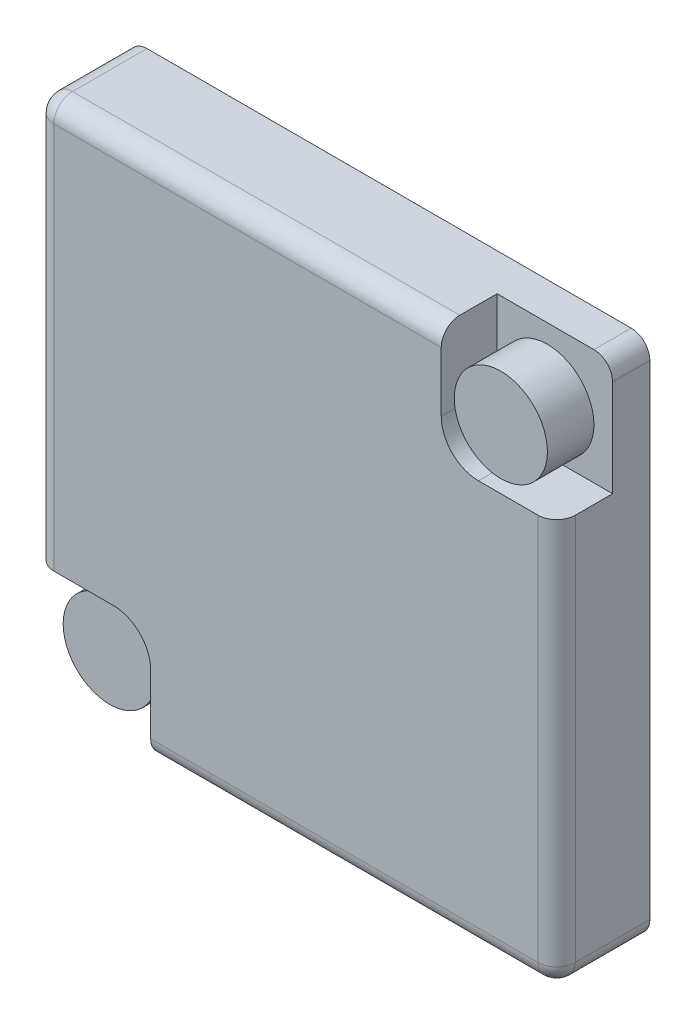
ISO-10303-21;
HEADER;
FILE_DESCRIPTION(('STEP AP214'),'2;1');
FILE_NAME('part.step','',(''),(''),'','','');
FILE_SCHEMA(('AUTOMOTIVE_DESIGN { 1 0 10303 214 1 1 1 1 }'));
ENDSEC;
DATA;
#1=APPLICATION_CONTEXT('core data for automotive mechanical design processes');
#2=APPLICATION_PROTOCOL_DEFINITION('international standard','automotive_design',2000,#1);
#3=PRODUCT_CONTEXT('',#1,'mechanical');
#4=PRODUCT('Part','Part','',(#3));
#5=PRODUCT_RELATED_PRODUCT_CATEGORY('part','',(#4));
#6=PRODUCT_DEFINITION_FORMATION('','',#4);
#7=PRODUCT_DEFINITION_CONTEXT('part definition',#1,'design');
#8=PRODUCT_DEFINITION('design','',#6,#7);
#9=PRODUCT_DEFINITION_SHAPE('','',#8);
#10=(LENGTH_UNIT() NAMED_UNIT(*) SI_UNIT(.MILLI.,.METRE.));
#11=(NAMED_UNIT(*) PLANE_ANGLE_UNIT() SI_UNIT($,.RADIAN.));
#12=(NAMED_UNIT(*) SI_UNIT($,.STERADIAN.) SOLID_ANGLE_UNIT());
#13=UNCERTAINTY_MEASURE_WITH_UNIT(LENGTH_MEASURE(1.E-05),#10,'distance_accuracy_value','');
#14=(GEOMETRIC_REPRESENTATION_CONTEXT(3) GLOBAL_UNCERTAINTY_ASSIGNED_CONTEXT((#13)) GLOBAL_UNIT_ASSIGNED_CONTEXT((#10,
#11,#12)) REPRESENTATION_CONTEXT('',''));
#15=CARTESIAN_POINT('',(0.,0.,0.));
#16=DIRECTION('',(0.,0.,1.));
#17=DIRECTION('',(1.,0.,0.));
#18=AXIS2_PLACEMENT_3D('',#15,#16,#17);
#19=CARTESIAN_POINT('',(-9.79999999999993,-9.80000000000006,-3.));
#20=DIRECTION('',(0.,0.,1.));
#21=DIRECTION('',(-1.,0.,0.));
#22=AXIS2_PLACEMENT_3D('',#19,#20,#21);
#23=PLANE('',#22);
#24=DIRECTION('',(1.,0.,0.));
#25=VECTOR('',#24,1.);
#26=CARTESIAN_POINT('',(-13.9999999999999,-14.0000000000001,-3.));
#27=LINE('',#26,#25);
#28=CARTESIAN_POINT('',(-13.,-14.0000000000001,-3.));
#29=VERTEX_POINT('',#28);
#30=CARTESIAN_POINT('',(-7.7999999999999,-14.,-3.));
#31=VERTEX_POINT('',#30);
#32=EDGE_CURVE('E164',#29,#31,#27,.T.);
#33=ORIENTED_EDGE('',*,*,#32,.T.);
#34=DIRECTION('',(0.,1.,0.));
#35=VECTOR('',#34,1.);
#36=CARTESIAN_POINT('',(-7.7999999999999,-14.,-3.));
#37=LINE('',#36,#35);
#38=CARTESIAN_POINT('',(-7.79999999999993,-9.80000000000005,-3.));
#39=VERTEX_POINT('',#38);
#40=EDGE_CURVE('E168',#31,#39,#37,.T.);
#41=ORIENTED_EDGE('',*,*,#40,.T.);
#42=CARTESIAN_POINT('',(-9.79999999999993,-9.80000000000006,-3.));
#43=DIRECTION('',(0.,0.,1.));
#44=DIRECTION('',(-1.,0.,0.));
#45=AXIS2_PLACEMENT_3D('',#42,#43,#44);
#46=CIRCLE('',#45,2.);
#47=CARTESIAN_POINT('',(-9.79999999999995,-7.80000000000006,-3.));
#48=VERTEX_POINT('',#47);
#49=EDGE_CURVE('E182',#39,#48,#46,.T.);
#50=ORIENTED_EDGE('',*,*,#49,.T.);
#51=DIRECTION('',(-1.,0.,0.));
#52=VECTOR('',#51,1.);
#53=CARTESIAN_POINT('',(-13.9999999999999,-7.80000000000009,-3.));
#54=LINE('',#53,#52);
#55=CARTESIAN_POINT('',(-13.9999999999999,-7.80000000000009,-3.));
#56=VERTEX_POINT('',#55);
#57=EDGE_CURVE('E188',#48,#56,#54,.T.);
#58=ORIENTED_EDGE('',*,*,#57,.T.);
#59=DIRECTION('',(0.,-1.,0.));
#60=VECTOR('',#59,1.);
#61=CARTESIAN_POINT('',(-13.9999999999999,-14.0000000000001,-3.));
#62=LINE('',#61,#60);
#63=CARTESIAN_POINT('',(-13.9999999999999,-13.,-3.));
#64=VERTEX_POINT('',#63);
#65=EDGE_CURVE('E173',#56,#64,#62,.T.);
#66=ORIENTED_EDGE('',*,*,#65,.T.);
#67=CARTESIAN_POINT('',(-13.,-13.,-3.));
#68=DIRECTION('',(0.,0.,1.));
#69=DIRECTION('',(1.,0.,0.));
#70=AXIS2_PLACEMENT_3D('',#67,#68,#69);
#71=CIRCLE('',#70,1.);
#72=EDGE_CURVE('E41',#29,#64,#71,.F.);
#73=ORIENTED_EDGE('',*,*,#72,.F.);
#74=EDGE_LOOP('',(#33,#41,#50,#58,#66,#73));
#75=FACE_BOUND('',#74,.T.);
#76=CARTESIAN_POINT('',(-10.4999999999999,-10.5000000000001,-3.));
#77=DIRECTION('',(0.,0.,1.));
#78=DIRECTION('',(-1.,0.,0.));
#79=AXIS2_PLACEMENT_3D('',#76,#77,#78);
#80=CIRCLE('',#79,2.5);
#81=CARTESIAN_POINT('',(-12.9999999999999,-10.5000000000001,-3.));
#82=VERTEX_POINT('',#81);
#83=EDGE_CURVE('E368',#82,#82,#80,.T.);
#84=ORIENTED_EDGE('',*,*,#83,.F.);
#85=EDGE_LOOP('',(#84));
#86=FACE_BOUND('',#85,.T.);
#87=ADVANCED_FACE('F33',(#75,#86),#23,.T.);
#88=CARTESIAN_POINT('',(-13.,-13.,-5.));
#89=DIRECTION('',(0.,0.,1.));
#90=DIRECTION('',(1.,0.,0.));
#91=AXIS2_PLACEMENT_3D('',#88,#89,#90);
#92=CYLINDRICAL_SURFACE('',#91,1.);
#93=DIRECTION('',(0.,0.,1.));
#94=VECTOR('',#93,1.);
#95=CARTESIAN_POINT('',(-13.,-14.,-5.));
#96=LINE('',#95,#94);
#97=CARTESIAN_POINT('',(-13.,-14.,-5.));
#98=VERTEX_POINT('',#97);
#99=EDGE_CURVE('E278',#29,#98,#96,.F.);
#100=ORIENTED_EDGE('',*,*,#99,.F.);
#101=ORIENTED_EDGE('',*,*,#72,.T.);
#102=DIRECTION('',(0.,0.,1.));
#103=VECTOR('',#102,1.);
#104=CARTESIAN_POINT('',(-14.,-13.,-5.));
#105=LINE('',#104,#103);
#106=CARTESIAN_POINT('',(-14.,-13.,-5.));
#107=VERTEX_POINT('',#106);
#108=EDGE_CURVE('E287',#107,#64,#105,.T.);
#109=ORIENTED_EDGE('',*,*,#108,.F.);
#110=CARTESIAN_POINT('',(-13.,-13.,-5.));
#111=DIRECTION('',(0.,0.,-1.));
#112=DIRECTION('',(-1.,0.,0.));
#113=AXIS2_PLACEMENT_3D('',#110,#111,#112);
#114=CIRCLE('',#113,1.);
#115=EDGE_CURVE('E272',#98,#107,#114,.T.);
#116=ORIENTED_EDGE('',*,*,#115,.F.);
#117=EDGE_LOOP('',(#100,#101,#109,#116));
#118=FACE_BOUND('',#117,.T.);
#119=ADVANCED_FACE('F316',(#118),#92,.T.);
#120=CARTESIAN_POINT('',(9.8,9.8,-3.));
#121=DIRECTION('',(0.,0.,1.));
#122=DIRECTION('',(1.,0.,0.));
#123=AXIS2_PLACEMENT_3D('',#120,#121,#122);
#124=PLANE('',#123);
#125=DIRECTION('',(-1.,0.,0.));
#126=VECTOR('',#125,1.);
#127=CARTESIAN_POINT('',(14.,14.,-3.));
#128=LINE('',#127,#126);
#129=CARTESIAN_POINT('',(13.,14.,-3.));
#130=VERTEX_POINT('',#129);
#131=CARTESIAN_POINT('',(7.8,14.,-3.));
#132=VERTEX_POINT('',#131);
#133=EDGE_CURVE('E206',#130,#132,#128,.T.);
#134=ORIENTED_EDGE('',*,*,#133,.T.);
#135=DIRECTION('',(0.,-1.,0.));
#136=VECTOR('',#135,1.);
#137=CARTESIAN_POINT('',(7.8,14.,-3.));
#138=LINE('',#137,#136);
#139=CARTESIAN_POINT('',(7.8,9.8,-3.));
#140=VERTEX_POINT('',#139);
#141=EDGE_CURVE('E209',#132,#140,#138,.T.);
#142=ORIENTED_EDGE('',*,*,#141,.T.);
#143=CARTESIAN_POINT('',(9.8,9.8,-3.));
#144=DIRECTION('',(0.,0.,1.));
#145=DIRECTION('',(1.,0.,0.));
#146=AXIS2_PLACEMENT_3D('',#143,#144,#145);
#147=CIRCLE('',#146,2.);
#148=CARTESIAN_POINT('',(9.8,7.8,-3.));
#149=VERTEX_POINT('',#148);
#150=EDGE_CURVE('E212',#140,#149,#147,.T.);
#151=ORIENTED_EDGE('',*,*,#150,.T.);
#152=DIRECTION('',(1.,0.,0.));
#153=VECTOR('',#152,1.);
#154=CARTESIAN_POINT('',(14.,7.8,-3.));
#155=LINE('',#154,#153);
#156=CARTESIAN_POINT('',(14.,7.8,-3.));
#157=VERTEX_POINT('',#156);
#158=EDGE_CURVE('E215',#149,#157,#155,.T.);
#159=ORIENTED_EDGE('',*,*,#158,.T.);
#160=DIRECTION('',(0.,1.,0.));
#161=VECTOR('',#160,1.);
#162=CARTESIAN_POINT('',(14.,14.,-3.));
#163=LINE('',#162,#161);
#164=CARTESIAN_POINT('',(14.,13.,-3.));
#165=VERTEX_POINT('',#164);
#166=EDGE_CURVE('E204',#157,#165,#163,.T.);
#167=ORIENTED_EDGE('',*,*,#166,.T.);
#168=CARTESIAN_POINT('',(13.,13.,-3.));
#169=DIRECTION('',(0.,0.,1.));
#170=DIRECTION('',(1.,0.,0.));
#171=AXIS2_PLACEMENT_3D('',#168,#169,#170);
#172=CIRCLE('',#171,1.);
#173=EDGE_CURVE('E310',#130,#165,#172,.F.);
#174=ORIENTED_EDGE('',*,*,#173,.F.);
#175=EDGE_LOOP('',(#134,#142,#151,#159,#167,#174));
#176=FACE_BOUND('',#175,.T.);
#177=CARTESIAN_POINT('',(10.5,10.5,-3.));
#178=DIRECTION('',(0.,0.,1.));
#179=DIRECTION('',(1.,0.,0.));
#180=AXIS2_PLACEMENT_3D('',#177,#178,#179);
#181=CIRCLE('',#180,2.5);
#182=CARTESIAN_POINT('',(13.,10.5,-3.));
#183=VERTEX_POINT('',#182);
#184=EDGE_CURVE('E200',#183,#183,#181,.T.);
#185=ORIENTED_EDGE('',*,*,#184,.F.);
#186=EDGE_LOOP('',(#185));
#187=FACE_BOUND('',#186,.T.);
#188=ADVANCED_FACE('F394',(#176,#187),#124,.T.);
#189=CARTESIAN_POINT('',(13.,13.,-5.));
#190=DIRECTION('',(0.,0.,1.));
#191=DIRECTION('',(1.,0.,0.));
#192=AXIS2_PLACEMENT_3D('',#189,#190,#191);
#193=CYLINDRICAL_SURFACE('',#192,1.);
#194=DIRECTION('',(0.,0.,1.));
#195=VECTOR('',#194,1.);
#196=CARTESIAN_POINT('',(13.,14.,-5.));
#197=LINE('',#196,#195);
#198=CARTESIAN_POINT('',(13.,14.,-5.));
#199=VERTEX_POINT('',#198);
#200=EDGE_CURVE('E261',#130,#199,#197,.F.);
#201=ORIENTED_EDGE('',*,*,#200,.F.);
#202=ORIENTED_EDGE('',*,*,#173,.T.);
#203=DIRECTION('',(0.,0.,1.));
#204=VECTOR('',#203,1.);
#205=CARTESIAN_POINT('',(14.,13.,-5.));
#206=LINE('',#205,#204);
#207=CARTESIAN_POINT('',(14.,13.,-5.));
#208=VERTEX_POINT('',#207);
#209=EDGE_CURVE('E267',#208,#165,#206,.T.);
#210=ORIENTED_EDGE('',*,*,#209,.F.);
#211=CARTESIAN_POINT('',(13.,13.,-5.));
#212=DIRECTION('',(0.,0.,-1.));
#213=DIRECTION('',(-1.,0.,0.));
#214=AXIS2_PLACEMENT_3D('',#211,#212,#213);
#215=CIRCLE('',#214,1.);
#216=EDGE_CURVE('E276',#199,#208,#215,.T.);
#217=ORIENTED_EDGE('',*,*,#216,.F.);
#218=EDGE_LOOP('',(#201,#202,#210,#217));
#219=FACE_BOUND('',#218,.T.);
#220=ADVANCED_FACE('F343',(#219),#193,.T.);
#221=CARTESIAN_POINT('',(14.,14.,-5.));
#222=DIRECTION('',(1.,0.,0.));
#223=DIRECTION('',(0.,1.,0.));
#224=AXIS2_PLACEMENT_3D('',#221,#222,#223);
#225=PLANE('',#224);
#226=DIRECTION('',(0.,0.,1.));
#227=VECTOR('',#226,1.);
#228=CARTESIAN_POINT('',(14.,7.8,-3.));
#229=LINE('',#228,#227);
#230=CARTESIAN_POINT('',(14.,7.8,-1.));
#231=VERTEX_POINT('',#230);
#232=EDGE_CURVE('E223',#157,#231,#229,.T.);
#233=ORIENTED_EDGE('',*,*,#232,.T.);
#234=DIRECTION('',(0.,1.,0.));
#235=VECTOR('',#234,1.);
#236=CARTESIAN_POINT('',(14.,-14.,-1.));
#237=LINE('',#236,#235);
#238=CARTESIAN_POINT('',(14.,-13.,-1.));
#239=VERTEX_POINT('',#238);
#240=EDGE_CURVE('E265',#231,#239,#237,.F.);
#241=ORIENTED_EDGE('',*,*,#240,.T.);
#242=DIRECTION('',(0.,0.,1.));
#243=VECTOR('',#242,1.);
#244=CARTESIAN_POINT('',(14.,-13.,-5.));
#245=LINE('',#244,#243);
#246=CARTESIAN_POINT('',(14.,-13.,-5.));
#247=VERTEX_POINT('',#246);
#248=EDGE_CURVE('E263',#239,#247,#245,.F.);
#249=ORIENTED_EDGE('',*,*,#248,.T.);
#250=DIRECTION('',(0.,1.,0.));
#251=VECTOR('',#250,1.);
#252=CARTESIAN_POINT('',(14.,14.,-5.));
#253=LINE('',#252,#251);
#254=EDGE_CURVE('E233',#247,#208,#253,.T.);
#255=ORIENTED_EDGE('',*,*,#254,.T.);
#256=ORIENTED_EDGE('',*,*,#209,.T.);
#257=ORIENTED_EDGE('',*,*,#166,.F.);
#258=EDGE_LOOP('',(#233,#241,#249,#255,#256,#257));
#259=FACE_BOUND('',#258,.T.);
#260=ADVANCED_FACE('F346',(#259),#225,.T.);
#261=CARTESIAN_POINT('',(14.,-14.,-5.));
#262=DIRECTION('',(0.,-1.,0.));
#263=DIRECTION('',(1.,0.,0.));
#264=AXIS2_PLACEMENT_3D('',#261,#262,#263);
#265=PLANE('',#264);
#266=DIRECTION('',(0.,0.,1.));
#267=VECTOR('',#266,1.);
#268=CARTESIAN_POINT('',(-7.7999999999999,-14.,-3.));
#269=LINE('',#268,#267);
#270=CARTESIAN_POINT('',(-7.7999999999999,-14.,-1.));
#271=VERTEX_POINT('',#270);
#272=EDGE_CURVE('E177',#31,#271,#269,.T.);
#273=ORIENTED_EDGE('',*,*,#272,.F.);
#274=ORIENTED_EDGE('',*,*,#32,.F.);
#275=ORIENTED_EDGE('',*,*,#99,.T.);
#276=DIRECTION('',(1.,0.,0.));
#277=VECTOR('',#276,1.);
#278=CARTESIAN_POINT('',(14.,-14.,-5.));
#279=LINE('',#278,#277);
#280=CARTESIAN_POINT('',(13.,-14.,-5.));
#281=VERTEX_POINT('',#280);
#282=EDGE_CURVE('E243',#98,#281,#279,.T.);
#283=ORIENTED_EDGE('',*,*,#282,.T.);
#284=DIRECTION('',(0.,0.,1.));
#285=VECTOR('',#284,1.);
#286=CARTESIAN_POINT('',(13.,-14.,-5.));
#287=LINE('',#286,#285);
#288=CARTESIAN_POINT('',(13.,-14.,-1.));
#289=VERTEX_POINT('',#288);
#290=EDGE_CURVE('E281',#281,#289,#287,.T.);
#291=ORIENTED_EDGE('',*,*,#290,.T.);
#292=DIRECTION('',(1.,0.,0.));
#293=VECTOR('',#292,1.);
#294=CARTESIAN_POINT('',(-14.,-14.,-1.));
#295=LINE('',#294,#293);
#296=EDGE_CURVE('E187',#289,#271,#295,.F.);
#297=ORIENTED_EDGE('',*,*,#296,.T.);
#298=EDGE_LOOP('',(#273,#274,#275,#283,#291,#297));
#299=FACE_BOUND('',#298,.T.);
#300=ADVANCED_FACE('F185',(#299),#265,.T.);
#301=CARTESIAN_POINT('',(-14.,14.,-5.));
#302=DIRECTION('',(-1.,0.,0.));
#303=DIRECTION('',(0.,-1.,0.));
#304=AXIS2_PLACEMENT_3D('',#301,#302,#303);
#305=PLANE('',#304);
#306=DIRECTION('',(0.,0.,1.));
#307=VECTOR('',#306,1.);
#308=CARTESIAN_POINT('',(-13.9999999999999,-7.80000000000009,-3.));
#309=LINE('',#308,#307);
#310=CARTESIAN_POINT('',(-13.9999999999999,-7.80000000000009,-1.));
#311=VERTEX_POINT('',#310);
#312=EDGE_CURVE('E203',#56,#311,#309,.T.);
#313=ORIENTED_EDGE('',*,*,#312,.T.);
#314=DIRECTION('',(0.,-1.,0.));
#315=VECTOR('',#314,1.);
#316=CARTESIAN_POINT('',(-14.,14.,-1.));
#317=LINE('',#316,#315);
#318=CARTESIAN_POINT('',(-14.,13.,-1.));
#319=VERTEX_POINT('',#318);
#320=EDGE_CURVE('E285',#311,#319,#317,.F.);
#321=ORIENTED_EDGE('',*,*,#320,.T.);
#322=DIRECTION('',(0.,0.,1.));
#323=VECTOR('',#322,1.);
#324=CARTESIAN_POINT('',(-14.,13.,-5.));
#325=LINE('',#324,#323);
#326=CARTESIAN_POINT('',(-14.,13.,-5.));
#327=VERTEX_POINT('',#326);
#328=EDGE_CURVE('E283',#319,#327,#325,.F.);
#329=ORIENTED_EDGE('',*,*,#328,.T.);
#330=DIRECTION('',(0.,-1.,0.));
#331=VECTOR('',#330,1.);
#332=CARTESIAN_POINT('',(-14.,14.,-5.));
#333=LINE('',#332,#331);
#334=EDGE_CURVE('E240',#327,#107,#333,.T.);
#335=ORIENTED_EDGE('',*,*,#334,.T.);
#336=ORIENTED_EDGE('',*,*,#108,.T.);
#337=ORIENTED_EDGE('',*,*,#65,.F.);
#338=EDGE_LOOP('',(#313,#321,#329,#335,#336,#337));
#339=FACE_BOUND('',#338,.T.);
#340=ADVANCED_FACE('F321',(#339),#305,.T.);
#341=CARTESIAN_POINT('',(14.,14.,-5.));
#342=DIRECTION('',(0.,1.,0.));
#343=DIRECTION('',(-1.,0.,0.));
#344=AXIS2_PLACEMENT_3D('',#341,#342,#343);
#345=PLANE('',#344);
#346=DIRECTION('',(0.,0.,1.));
#347=VECTOR('',#346,1.);
#348=CARTESIAN_POINT('',(7.8,14.,-3.));
#349=LINE('',#348,#347);
#350=CARTESIAN_POINT('',(7.8,14.,-1.));
#351=VERTEX_POINT('',#350);
#352=EDGE_CURVE('E56',#132,#351,#349,.T.);
#353=ORIENTED_EDGE('',*,*,#352,.F.);
#354=ORIENTED_EDGE('',*,*,#133,.F.);
#355=ORIENTED_EDGE('',*,*,#200,.T.);
#356=DIRECTION('',(-1.,0.,0.));
#357=VECTOR('',#356,1.);
#358=CARTESIAN_POINT('',(14.,14.,-5.));
#359=LINE('',#358,#357);
#360=CARTESIAN_POINT('',(-13.,14.,-5.));
#361=VERTEX_POINT('',#360);
#362=EDGE_CURVE('E236',#199,#361,#359,.T.);
#363=ORIENTED_EDGE('',*,*,#362,.T.);
#364=DIRECTION('',(0.,0.,1.));
#365=VECTOR('',#364,1.);
#366=CARTESIAN_POINT('',(-13.,14.,-5.));
#367=LINE('',#366,#365);
#368=CARTESIAN_POINT('',(-13.,14.,-1.));
#369=VERTEX_POINT('',#368);
#370=EDGE_CURVE('E256',#361,#369,#367,.T.);
#371=ORIENTED_EDGE('',*,*,#370,.T.);
#372=DIRECTION('',(-1.,0.,0.));
#373=VECTOR('',#372,1.);
#374=CARTESIAN_POINT('',(14.,14.,-1.));
#375=LINE('',#374,#373);
#376=EDGE_CURVE('E258',#369,#351,#375,.F.);
#377=ORIENTED_EDGE('',*,*,#376,.T.);
#378=EDGE_LOOP('',(#353,#354,#355,#363,#371,#377));
#379=FACE_BOUND('',#378,.T.);
#380=ADVANCED_FACE('F336',(#379),#345,.T.);
#381=CARTESIAN_POINT('',(14.,-14.,-5.));
#382=DIRECTION('',(0.,0.,-1.));
#383=DIRECTION('',(-1.,0.,0.));
#384=AXIS2_PLACEMENT_3D('',#381,#382,#383);
#385=PLANE('',#384);
#386=ORIENTED_EDGE('',*,*,#362,.F.);
#387=ORIENTED_EDGE('',*,*,#216,.T.);
#388=ORIENTED_EDGE('',*,*,#254,.F.);
#389=CARTESIAN_POINT('',(13.,-13.,-5.));
#390=DIRECTION('',(0.,0.,-1.));
#391=DIRECTION('',(-1.,0.,0.));
#392=AXIS2_PLACEMENT_3D('',#389,#390,#391);
#393=CIRCLE('',#392,1.);
#394=EDGE_CURVE('E274',#247,#281,#393,.T.);
#395=ORIENTED_EDGE('',*,*,#394,.T.);
#396=ORIENTED_EDGE('',*,*,#282,.F.);
#397=ORIENTED_EDGE('',*,*,#115,.T.);
#398=ORIENTED_EDGE('',*,*,#334,.F.);
#399=CARTESIAN_POINT('',(-13.,13.,-5.));
#400=DIRECTION('',(0.,0.,-1.));
#401=DIRECTION('',(-1.,0.,0.));
#402=AXIS2_PLACEMENT_3D('',#399,#400,#401);
#403=CIRCLE('',#402,1.);
#404=EDGE_CURVE('E270',#327,#361,#403,.T.);
#405=ORIENTED_EDGE('',*,*,#404,.T.);
#406=EDGE_LOOP('',(#386,#387,#388,#395,#396,#397,#398,#405));
#407=FACE_BOUND('',#406,.T.);
#408=ADVANCED_FACE('F327',(#407),#385,.T.);
#409=CARTESIAN_POINT('',(14.,-14.,0.));
#410=DIRECTION('',(0.,0.,-1.));
#411=DIRECTION('',(-1.,0.,0.));
#412=AXIS2_PLACEMENT_3D('',#409,#410,#411);
#413=PLANE('',#412);
#414=DIRECTION('',(0.,-1.,0.));
#415=VECTOR('',#414,1.);
#416=CARTESIAN_POINT('',(-13.,-14.,0.));
#417=LINE('',#416,#415);
#418=CARTESIAN_POINT('',(-13.,13.,0.));
#419=VERTEX_POINT('',#418);
#420=CARTESIAN_POINT('',(-13.,-7.80000000000008,0.));
#421=VERTEX_POINT('',#420);
#422=EDGE_CURVE('E246',#419,#421,#417,.T.);
#423=ORIENTED_EDGE('',*,*,#422,.T.);
#424=DIRECTION('',(-1.,0.,0.));
#425=VECTOR('',#424,1.);
#426=CARTESIAN_POINT('',(-13.9999999999999,-7.80000000000009,0.));
#427=LINE('',#426,#425);
#428=CARTESIAN_POINT('',(-9.79999999999995,-7.80000000000006,0.));
#429=VERTEX_POINT('',#428);
#430=EDGE_CURVE('E48',#429,#421,#427,.T.);
#431=ORIENTED_EDGE('',*,*,#430,.F.);
#432=CARTESIAN_POINT('',(-9.79999999999993,-9.80000000000006,0.));
#433=DIRECTION('',(0.,0.,1.));
#434=DIRECTION('',(-1.,0.,0.));
#435=AXIS2_PLACEMENT_3D('',#432,#433,#434);
#436=CIRCLE('',#435,2.);
#437=CARTESIAN_POINT('',(-7.79999999999993,-9.80000000000005,0.));
#438=VERTEX_POINT('',#437);
#439=EDGE_CURVE('E363',#438,#429,#436,.T.);
#440=ORIENTED_EDGE('',*,*,#439,.F.);
#441=DIRECTION('',(0.,1.,0.));
#442=VECTOR('',#441,1.);
#443=CARTESIAN_POINT('',(-7.7999999999999,-14.,0.));
#444=LINE('',#443,#442);
#445=CARTESIAN_POINT('',(-7.79999999999991,-13.,0.));
#446=VERTEX_POINT('',#445);
#447=EDGE_CURVE('E358',#446,#438,#444,.T.);
#448=ORIENTED_EDGE('',*,*,#447,.F.);
#449=DIRECTION('',(1.,0.,0.));
#450=VECTOR('',#449,1.);
#451=CARTESIAN_POINT('',(14.,-13.,0.));
#452=LINE('',#451,#450);
#453=CARTESIAN_POINT('',(13.,-13.,0.));
#454=VERTEX_POINT('',#453);
#455=EDGE_CURVE('E249',#446,#454,#452,.T.);
#456=ORIENTED_EDGE('',*,*,#455,.T.);
#457=DIRECTION('',(0.,1.,0.));
#458=VECTOR('',#457,1.);
#459=CARTESIAN_POINT('',(13.,14.,0.));
#460=LINE('',#459,#458);
#461=CARTESIAN_POINT('',(13.,7.8,0.));
#462=VERTEX_POINT('',#461);
#463=EDGE_CURVE('E251',#454,#462,#460,.T.);
#464=ORIENTED_EDGE('',*,*,#463,.T.);
#465=DIRECTION('',(1.,0.,0.));
#466=VECTOR('',#465,1.);
#467=CARTESIAN_POINT('',(14.,7.8,0.));
#468=LINE('',#467,#466);
#469=CARTESIAN_POINT('',(9.8,7.8,0.));
#470=VERTEX_POINT('',#469);
#471=EDGE_CURVE('E207',#470,#462,#468,.T.);
#472=ORIENTED_EDGE('',*,*,#471,.F.);
#473=CARTESIAN_POINT('',(9.8,9.8,0.));
#474=DIRECTION('',(0.,0.,1.));
#475=DIRECTION('',(1.,0.,0.));
#476=AXIS2_PLACEMENT_3D('',#473,#474,#475);
#477=CIRCLE('',#476,2.);
#478=CARTESIAN_POINT('',(7.8,9.8,0.));
#479=VERTEX_POINT('',#478);
#480=EDGE_CURVE('E219',#479,#470,#477,.T.);
#481=ORIENTED_EDGE('',*,*,#480,.F.);
#482=DIRECTION('',(0.,-1.,0.));
#483=VECTOR('',#482,1.);
#484=CARTESIAN_POINT('',(7.8,14.,0.));
#485=LINE('',#484,#483);
#486=CARTESIAN_POINT('',(7.8,13.,0.));
#487=VERTEX_POINT('',#486);
#488=EDGE_CURVE('E199',#487,#479,#485,.T.);
#489=ORIENTED_EDGE('',*,*,#488,.F.);
#490=DIRECTION('',(-1.,0.,0.));
#491=VECTOR('',#490,1.);
#492=CARTESIAN_POINT('',(-14.,13.,0.));
#493=LINE('',#492,#491);
#494=EDGE_CURVE('E254',#487,#419,#493,.T.);
#495=ORIENTED_EDGE('',*,*,#494,.T.);
#496=EDGE_LOOP('',(#423,#431,#440,#448,#456,#464,#472,#481,#489,#495));
#497=FACE_BOUND('',#496,.T.);
#498=ADVANCED_FACE('F361',(#497),#413,.F.);
#499=CARTESIAN_POINT('',(13.,-13.,-5.));
#500=DIRECTION('',(0.,0.,1.));
#501=DIRECTION('',(1.,0.,0.));
#502=AXIS2_PLACEMENT_3D('',#499,#500,#501);
#503=CYLINDRICAL_SURFACE('',#502,1.);
#504=ORIENTED_EDGE('',*,*,#394,.F.);
#505=ORIENTED_EDGE('',*,*,#248,.F.);
#506=CARTESIAN_POINT('',(13.,-13.,-1.));
#507=DIRECTION('',(0.,0.,1.));
#508=DIRECTION('',(1.,0.,0.));
#509=AXIS2_PLACEMENT_3D('',#506,#507,#508);
#510=CIRCLE('',#509,1.);
#511=EDGE_CURVE('E237',#289,#239,#510,.T.);
#512=ORIENTED_EDGE('',*,*,#511,.F.);
#513=ORIENTED_EDGE('',*,*,#290,.F.);
#514=EDGE_LOOP('',(#504,#505,#512,#513));
#515=FACE_BOUND('',#514,.T.);
#516=ADVANCED_FACE('F35',(#515),#503,.T.);
#517=CARTESIAN_POINT('',(14.,-13.,-1.));
#518=DIRECTION('',(-1.,0.,0.));
#519=DIRECTION('',(0.,-1.,0.));
#520=AXIS2_PLACEMENT_3D('',#517,#518,#519);
#521=CYLINDRICAL_SURFACE('',#520,1.);
#522=CARTESIAN_POINT('',(-7.79999999999991,-13.,-1.));
#523=DIRECTION('',(1.,0.,0.));
#524=DIRECTION('',(0.,1.,0.));
#525=AXIS2_PLACEMENT_3D('',#522,#523,#524);
#526=CIRCLE('',#525,1.);
#527=EDGE_CURVE('E11',#271,#446,#526,.F.);
#528=ORIENTED_EDGE('',*,*,#527,.F.);
#529=ORIENTED_EDGE('',*,*,#296,.F.);
#530=CARTESIAN_POINT('',(13.,-13.,-1.));
#531=DIRECTION('',(1.,0.,0.));
#532=DIRECTION('',(0.,0.,-1.));
#533=AXIS2_PLACEMENT_3D('',#530,#531,#532);
#534=CIRCLE('',#533,1.);
#535=EDGE_CURVE('E302',#454,#289,#534,.T.);
#536=ORIENTED_EDGE('',*,*,#535,.F.);
#537=ORIENTED_EDGE('',*,*,#455,.F.);
#538=EDGE_LOOP('',(#528,#529,#536,#537));
#539=FACE_BOUND('',#538,.T.);
#540=ADVANCED_FACE('F354',(#539),#521,.T.);
#541=CARTESIAN_POINT('',(13.,-13.,-1.));
#542=DIRECTION('',(0.,0.,1.));
#543=DIRECTION('',(1.,0.,0.));
#544=AXIS2_PLACEMENT_3D('',#541,#542,#543);
#545=SPHERICAL_SURFACE('',#544,1.);
#546=ORIENTED_EDGE('',*,*,#535,.T.);
#547=ORIENTED_EDGE('',*,*,#511,.T.);
#548=CARTESIAN_POINT('',(13.,-13.,-1.));
#549=DIRECTION('',(0.,-1.,0.));
#550=DIRECTION('',(0.,0.,-1.));
#551=AXIS2_PLACEMENT_3D('',#548,#549,#550);
#552=CIRCLE('',#551,1.);
#553=EDGE_CURVE('E299',#454,#239,#552,.F.);
#554=ORIENTED_EDGE('',*,*,#553,.F.);
#555=EDGE_LOOP('',(#546,#547,#554));
#556=FACE_BOUND('',#555,.T.);
#557=ADVANCED_FACE('F454',(#556),#545,.T.);
#558=CARTESIAN_POINT('',(13.,-14.,-1.));
#559=DIRECTION('',(0.,-1.,0.));
#560=DIRECTION('',(1.,0.,0.));
#561=AXIS2_PLACEMENT_3D('',#558,#559,#560);
#562=CYLINDRICAL_SURFACE('',#561,1.);
#563=CARTESIAN_POINT('',(13.,7.8,-1.));
#564=DIRECTION('',(0.,-1.,0.));
#565=DIRECTION('',(1.,0.,0.));
#566=AXIS2_PLACEMENT_3D('',#563,#564,#565);
#567=CIRCLE('',#566,1.);
#568=EDGE_CURVE('E308',#462,#231,#567,.F.);
#569=ORIENTED_EDGE('',*,*,#568,.F.);
#570=ORIENTED_EDGE('',*,*,#463,.F.);
#571=ORIENTED_EDGE('',*,*,#553,.T.);
#572=ORIENTED_EDGE('',*,*,#240,.F.);
#573=EDGE_LOOP('',(#569,#570,#571,#572));
#574=FACE_BOUND('',#573,.T.);
#575=ADVANCED_FACE('F451',(#574),#562,.T.);
#576=CARTESIAN_POINT('',(-13.,-14.,-1.));
#577=DIRECTION('',(0.,1.,0.));
#578=DIRECTION('',(-1.,0.,0.));
#579=AXIS2_PLACEMENT_3D('',#576,#577,#578);
#580=CYLINDRICAL_SURFACE('',#579,1.);
#581=CARTESIAN_POINT('',(-13.,-7.80000000000009,-1.));
#582=DIRECTION('',(0.,1.,0.));
#583=DIRECTION('',(-1.,0.,0.));
#584=AXIS2_PLACEMENT_3D('',#581,#582,#583);
#585=CIRCLE('',#584,1.);
#586=EDGE_CURVE('E313',#421,#311,#585,.F.);
#587=ORIENTED_EDGE('',*,*,#586,.F.);
#588=ORIENTED_EDGE('',*,*,#422,.F.);
#589=CARTESIAN_POINT('',(-13.,13.,-1.));
#590=DIRECTION('',(0.,1.,0.));
#591=DIRECTION('',(0.,0.,1.));
#592=AXIS2_PLACEMENT_3D('',#589,#590,#591);
#593=CIRCLE('',#592,1.);
#594=EDGE_CURVE('E296',#319,#419,#593,.T.);
#595=ORIENTED_EDGE('',*,*,#594,.F.);
#596=ORIENTED_EDGE('',*,*,#320,.F.);
#597=EDGE_LOOP('',(#587,#588,#595,#596));
#598=FACE_BOUND('',#597,.T.);
#599=ADVANCED_FACE('F381',(#598),#580,.T.);
#600=CARTESIAN_POINT('',(-13.,13.,-5.));
#601=DIRECTION('',(0.,0.,1.));
#602=DIRECTION('',(1.,0.,0.));
#603=AXIS2_PLACEMENT_3D('',#600,#601,#602);
#604=CYLINDRICAL_SURFACE('',#603,1.);
#605=ORIENTED_EDGE('',*,*,#404,.F.);
#606=ORIENTED_EDGE('',*,*,#328,.F.);
#607=CARTESIAN_POINT('',(-13.,13.,-1.));
#608=DIRECTION('',(0.,0.,1.));
#609=DIRECTION('',(1.,0.,0.));
#610=AXIS2_PLACEMENT_3D('',#607,#608,#609);
#611=CIRCLE('',#610,1.);
#612=EDGE_CURVE('E293',#369,#319,#611,.T.);
#613=ORIENTED_EDGE('',*,*,#612,.F.);
#614=ORIENTED_EDGE('',*,*,#370,.F.);
#615=EDGE_LOOP('',(#605,#606,#613,#614));
#616=FACE_BOUND('',#615,.T.);
#617=ADVANCED_FACE('F331',(#616),#604,.T.);
#618=CARTESIAN_POINT('',(-13.,13.,-1.));
#619=DIRECTION('',(0.,0.,1.));
#620=DIRECTION('',(1.,0.,0.));
#621=AXIS2_PLACEMENT_3D('',#618,#619,#620);
#622=SPHERICAL_SURFACE('',#621,1.);
#623=ORIENTED_EDGE('',*,*,#612,.T.);
#624=ORIENTED_EDGE('',*,*,#594,.T.);
#625=CARTESIAN_POINT('',(-13.,13.,-1.));
#626=DIRECTION('',(-1.,0.,0.));
#627=DIRECTION('',(0.,-1.,0.));
#628=AXIS2_PLACEMENT_3D('',#625,#626,#627);
#629=CIRCLE('',#628,1.);
#630=EDGE_CURVE('E226',#369,#419,#629,.F.);
#631=ORIENTED_EDGE('',*,*,#630,.F.);
#632=EDGE_LOOP('',(#623,#624,#631));
#633=FACE_BOUND('',#632,.T.);
#634=ADVANCED_FACE('F442',(#633),#622,.T.);
#635=CARTESIAN_POINT('',(14.,13.,-1.));
#636=DIRECTION('',(1.,0.,0.));
#637=DIRECTION('',(0.,1.,0.));
#638=AXIS2_PLACEMENT_3D('',#635,#636,#637);
#639=CYLINDRICAL_SURFACE('',#638,1.);
#640=CARTESIAN_POINT('',(7.8,13.,-1.));
#641=DIRECTION('',(-1.,0.,0.));
#642=DIRECTION('',(0.,-1.,0.));
#643=AXIS2_PLACEMENT_3D('',#640,#641,#642);
#644=CIRCLE('',#643,1.);
#645=EDGE_CURVE('E290',#351,#487,#644,.F.);
#646=ORIENTED_EDGE('',*,*,#645,.F.);
#647=ORIENTED_EDGE('',*,*,#376,.F.);
#648=ORIENTED_EDGE('',*,*,#630,.T.);
#649=ORIENTED_EDGE('',*,*,#494,.F.);
#650=EDGE_LOOP('',(#646,#647,#648,#649));
#651=FACE_BOUND('',#650,.T.);
#652=ADVANCED_FACE('F421',(#651),#639,.T.);
#653=CARTESIAN_POINT('',(14.,7.8,-3.));
#654=DIRECTION('',(0.,-1.,0.));
#655=DIRECTION('',(1.,0.,0.));
#656=AXIS2_PLACEMENT_3D('',#653,#654,#655);
#657=PLANE('',#656);
#658=ORIENTED_EDGE('',*,*,#568,.T.);
#659=ORIENTED_EDGE('',*,*,#232,.F.);
#660=ORIENTED_EDGE('',*,*,#158,.F.);
#661=DIRECTION('',(0.,0.,1.));
#662=VECTOR('',#661,1.);
#663=CARTESIAN_POINT('',(9.8,7.8,-3.));
#664=LINE('',#663,#662);
#665=EDGE_CURVE('E227',#149,#470,#664,.T.);
#666=ORIENTED_EDGE('',*,*,#665,.T.);
#667=ORIENTED_EDGE('',*,*,#471,.T.);
#668=EDGE_LOOP('',(#658,#659,#660,#666,#667));
#669=FACE_BOUND('',#668,.T.);
#670=ADVANCED_FACE('F417',(#669),#657,.F.);
#671=CARTESIAN_POINT('',(9.8,9.8,-3.));
#672=DIRECTION('',(0.,0.,1.));
#673=DIRECTION('',(1.,0.,0.));
#674=AXIS2_PLACEMENT_3D('',#671,#672,#673);
#675=CYLINDRICAL_SURFACE('',#674,2.);
#676=ORIENTED_EDGE('',*,*,#480,.T.);
#677=ORIENTED_EDGE('',*,*,#665,.F.);
#678=ORIENTED_EDGE('',*,*,#150,.F.);
#679=DIRECTION('',(0.,0.,1.));
#680=VECTOR('',#679,1.);
#681=CARTESIAN_POINT('',(7.8,9.8,-3.));
#682=LINE('',#681,#680);
#683=EDGE_CURVE('E229',#140,#479,#682,.T.);
#684=ORIENTED_EDGE('',*,*,#683,.T.);
#685=EDGE_LOOP('',(#676,#677,#678,#684));
#686=FACE_BOUND('',#685,.T.);
#687=ADVANCED_FACE('F420',(#686),#675,.F.);
#688=CARTESIAN_POINT('',(7.8,14.,-3.));
#689=DIRECTION('',(-1.,0.,0.));
#690=DIRECTION('',(0.,-1.,0.));
#691=AXIS2_PLACEMENT_3D('',#688,#689,#690);
#692=PLANE('',#691);
#693=ORIENTED_EDGE('',*,*,#645,.T.);
#694=ORIENTED_EDGE('',*,*,#488,.T.);
#695=ORIENTED_EDGE('',*,*,#683,.F.);
#696=ORIENTED_EDGE('',*,*,#141,.F.);
#697=ORIENTED_EDGE('',*,*,#352,.T.);
#698=EDGE_LOOP('',(#693,#694,#695,#696,#697));
#699=FACE_BOUND('',#698,.T.);
#700=ADVANCED_FACE('F412',(#699),#692,.F.);
#701=CARTESIAN_POINT('',(10.5,10.5,-0.5));
#702=DIRECTION('',(0.,0.,-1.));
#703=DIRECTION('',(-1.,0.,0.));
#704=AXIS2_PLACEMENT_3D('',#701,#702,#703);
#705=CYLINDRICAL_SURFACE('',#704,2.5);
#706=CARTESIAN_POINT('',(10.5,10.5,-0.5));
#707=DIRECTION('',(0.,0.,1.));
#708=DIRECTION('',(1.,0.,0.));
#709=AXIS2_PLACEMENT_3D('',#706,#707,#708);
#710=CIRCLE('',#709,2.5);
#711=CARTESIAN_POINT('',(13.,10.5,-0.5));
#712=VERTEX_POINT('',#711);
#713=EDGE_CURVE('E196',#712,#712,#710,.T.);
#714=ORIENTED_EDGE('',*,*,#713,.F.);
#715=EDGE_LOOP('',(#714));
#716=FACE_BOUND('',#715,.T.);
#717=ORIENTED_EDGE('',*,*,#184,.T.);
#718=EDGE_LOOP('',(#717));
#719=FACE_BOUND('',#718,.T.);
#720=ADVANCED_FACE('F408',(#716,#719),#705,.T.);
#721=CARTESIAN_POINT('',(10.5,10.5,-0.5));
#722=DIRECTION('',(0.,0.,1.));
#723=DIRECTION('',(1.,0.,0.));
#724=AXIS2_PLACEMENT_3D('',#721,#722,#723);
#725=PLANE('',#724);
#726=ORIENTED_EDGE('',*,*,#713,.T.);
#727=EDGE_LOOP('',(#726));
#728=FACE_BOUND('',#727,.T.);
#729=ADVANCED_FACE('F401',(#728),#725,.T.);
#730=CARTESIAN_POINT('',(-13.9999999999999,-7.80000000000009,-3.));
#731=DIRECTION('',(0.,1.,0.));
#732=DIRECTION('',(-1.,0.,0.));
#733=AXIS2_PLACEMENT_3D('',#730,#731,#732);
#734=PLANE('',#733);
#735=ORIENTED_EDGE('',*,*,#586,.T.);
#736=ORIENTED_EDGE('',*,*,#312,.F.);
#737=ORIENTED_EDGE('',*,*,#57,.F.);
#738=DIRECTION('',(0.,0.,1.));
#739=VECTOR('',#738,1.);
#740=CARTESIAN_POINT('',(-9.79999999999995,-7.80000000000006,-3.));
#741=LINE('',#740,#739);
#742=EDGE_CURVE('E190',#48,#429,#741,.T.);
#743=ORIENTED_EDGE('',*,*,#742,.T.);
#744=ORIENTED_EDGE('',*,*,#430,.T.);
#745=EDGE_LOOP('',(#735,#736,#737,#743,#744));
#746=FACE_BOUND('',#745,.T.);
#747=ADVANCED_FACE('F374',(#746),#734,.F.);
#748=CARTESIAN_POINT('',(-9.79999999999993,-9.80000000000006,-3.));
#749=DIRECTION('',(0.,0.,1.));
#750=DIRECTION('',(1.,0.,0.));
#751=AXIS2_PLACEMENT_3D('',#748,#749,#750);
#752=CYLINDRICAL_SURFACE('',#751,2.);
#753=ORIENTED_EDGE('',*,*,#439,.T.);
#754=ORIENTED_EDGE('',*,*,#742,.F.);
#755=ORIENTED_EDGE('',*,*,#49,.F.);
#756=DIRECTION('',(0.,0.,1.));
#757=VECTOR('',#756,1.);
#758=CARTESIAN_POINT('',(-7.79999999999993,-9.80000000000005,-3.));
#759=LINE('',#758,#757);
#760=EDGE_CURVE('E180',#39,#438,#759,.T.);
#761=ORIENTED_EDGE('',*,*,#760,.T.);
#762=EDGE_LOOP('',(#753,#754,#755,#761));
#763=FACE_BOUND('',#762,.T.);
#764=ADVANCED_FACE('F376',(#763),#752,.F.);
#765=CARTESIAN_POINT('',(-7.7999999999999,-14.,-3.));
#766=DIRECTION('',(1.,0.,0.));
#767=DIRECTION('',(0.,1.,0.));
#768=AXIS2_PLACEMENT_3D('',#765,#766,#767);
#769=PLANE('',#768);
#770=ORIENTED_EDGE('',*,*,#527,.T.);
#771=ORIENTED_EDGE('',*,*,#447,.T.);
#772=ORIENTED_EDGE('',*,*,#760,.F.);
#773=ORIENTED_EDGE('',*,*,#40,.F.);
#774=ORIENTED_EDGE('',*,*,#272,.T.);
#775=EDGE_LOOP('',(#770,#771,#772,#773,#774));
#776=FACE_BOUND('',#775,.T.);
#777=ADVANCED_FACE('F176',(#776),#769,.F.);
#778=CARTESIAN_POINT('',(-10.4999999999999,-10.5000000000001,-0.5));
#779=DIRECTION('',(0.,0.,-1.));
#780=DIRECTION('',(-1.,0.,0.));
#781=AXIS2_PLACEMENT_3D('',#778,#779,#780);
#782=CYLINDRICAL_SURFACE('',#781,2.5);
#783=CARTESIAN_POINT('',(-10.4999999999999,-10.5000000000001,-0.5));
#784=DIRECTION('',(0.,0.,1.));
#785=DIRECTION('',(-1.,0.,0.));
#786=AXIS2_PLACEMENT_3D('',#783,#784,#785);
#787=CIRCLE('',#786,2.5);
#788=CARTESIAN_POINT('',(-12.9999999999999,-10.5000000000001,-0.5));
#789=VERTEX_POINT('',#788);
#790=EDGE_CURVE('E364',#789,#789,#787,.T.);
#791=ORIENTED_EDGE('',*,*,#790,.F.);
#792=EDGE_LOOP('',(#791));
#793=FACE_BOUND('',#792,.T.);
#794=ORIENTED_EDGE('',*,*,#83,.T.);
#795=EDGE_LOOP('',(#794));
#796=FACE_BOUND('',#795,.T.);
#797=ADVANCED_FACE('F388',(#793,#796),#782,.T.);
#798=CARTESIAN_POINT('',(-10.4999999999999,-10.5000000000001,-0.5));
#799=DIRECTION('',(0.,0.,1.));
#800=DIRECTION('',(-1.,0.,0.));
#801=AXIS2_PLACEMENT_3D('',#798,#799,#800);
#802=PLANE('',#801);
#803=ORIENTED_EDGE('',*,*,#790,.T.);
#804=EDGE_LOOP('',(#803));
#805=FACE_BOUND('',#804,.T.);
#806=ADVANCED_FACE('F621',(#805),#802,.T.);
#807=CLOSED_SHELL('',(#87,#119,#188,#220,#260,#300,#340,#380,#408,#498,#516,#540,#557,#575,#599,
#617,#634,#652,#670,#687,#700,#720,#729,#747,#764,#777,#797,#806));
#808=MANIFOLD_SOLID_BREP('B2',#807);
#809=ADVANCED_BREP_SHAPE_REPRESENTATION('',(#18,#808),#14);
#810=SHAPE_DEFINITION_REPRESENTATION(#9,#809);
ENDSEC;
END-ISO-10303-21;
